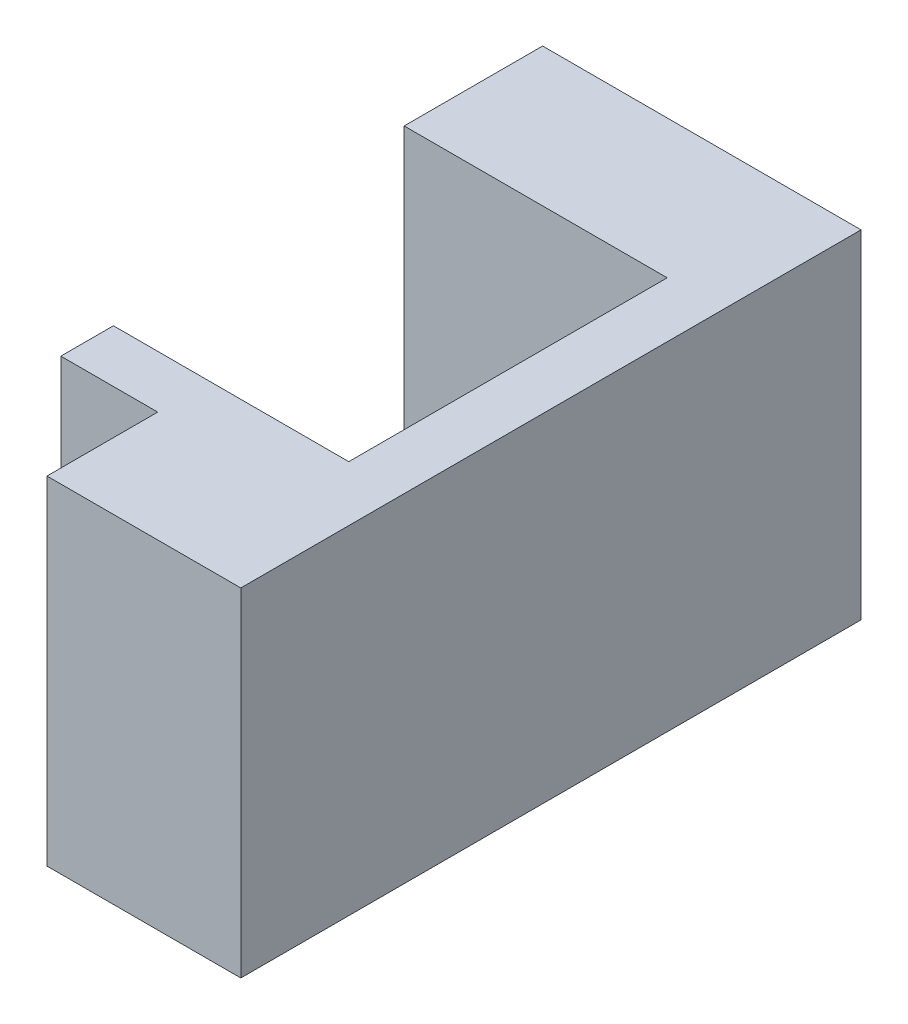
ISO-10303-21;
HEADER;
FILE_DESCRIPTION(('STEP AP214'),'2;1');
FILE_NAME('part.step','',(''),(''),'','','');
FILE_SCHEMA(('AUTOMOTIVE_DESIGN { 1 0 10303 214 1 1 1 1 }'));
ENDSEC;
DATA;
#1=APPLICATION_CONTEXT('core data for automotive mechanical design processes');
#2=APPLICATION_PROTOCOL_DEFINITION('international standard','automotive_design',2000,#1);
#3=PRODUCT_CONTEXT('',#1,'mechanical');
#4=PRODUCT('Part','Part','',(#3));
#5=PRODUCT_RELATED_PRODUCT_CATEGORY('part','',(#4));
#6=PRODUCT_DEFINITION_FORMATION('','',#4);
#7=PRODUCT_DEFINITION_CONTEXT('part definition',#1,'design');
#8=PRODUCT_DEFINITION('design','',#6,#7);
#9=PRODUCT_DEFINITION_SHAPE('','',#8);
#10=(LENGTH_UNIT() NAMED_UNIT(*) SI_UNIT(.MILLI.,.METRE.));
#11=(NAMED_UNIT(*) PLANE_ANGLE_UNIT() SI_UNIT($,.RADIAN.));
#12=(NAMED_UNIT(*) SI_UNIT($,.STERADIAN.) SOLID_ANGLE_UNIT());
#13=UNCERTAINTY_MEASURE_WITH_UNIT(LENGTH_MEASURE(1.E-05),#10,'distance_accuracy_value','');
#14=(GEOMETRIC_REPRESENTATION_CONTEXT(3) GLOBAL_UNCERTAINTY_ASSIGNED_CONTEXT((#13)) GLOBAL_UNIT_ASSIGNED_CONTEXT((#10,
#11,#12)) REPRESENTATION_CONTEXT('',''));
#15=CARTESIAN_POINT('',(0.,0.,0.));
#16=DIRECTION('',(0.,0.,1.));
#17=DIRECTION('',(1.,0.,0.));
#18=AXIS2_PLACEMENT_3D('',#15,#16,#17);
#19=CARTESIAN_POINT('',(0.,12.2,-5.));
#20=DIRECTION('',(1.,0.,0.));
#21=DIRECTION('',(0.,0.,-1.));
#22=AXIS2_PLACEMENT_3D('',#19,#20,#21);
#23=PLANE('',#22);
#24=DIRECTION('',(0.,0.,1.));
#25=VECTOR('',#24,1.);
#26=CARTESIAN_POINT('',(0.,0.,-5.));
#27=LINE('',#26,#25);
#28=CARTESIAN_POINT('',(0.,0.,-5.));
#29=VERTEX_POINT('',#28);
#30=CARTESIAN_POINT('',(0.,0.,0.));
#31=VERTEX_POINT('',#30);
#32=EDGE_CURVE('E144',#29,#31,#27,.T.);
#33=ORIENTED_EDGE('',*,*,#32,.T.);
#34=DIRECTION('',(0.,-1.,0.));
#35=VECTOR('',#34,1.);
#36=CARTESIAN_POINT('',(0.,12.2,0.));
#37=LINE('',#36,#35);
#38=CARTESIAN_POINT('',(0.,12.2,0.));
#39=VERTEX_POINT('',#38);
#40=EDGE_CURVE('E11',#39,#31,#37,.T.);
#41=ORIENTED_EDGE('',*,*,#40,.F.);
#42=DIRECTION('',(0.,0.,1.));
#43=VECTOR('',#42,1.);
#44=CARTESIAN_POINT('',(0.,12.2,-5.));
#45=LINE('',#44,#43);
#46=CARTESIAN_POINT('',(0.,12.2,-5.));
#47=VERTEX_POINT('',#46);
#48=EDGE_CURVE('E162',#47,#39,#45,.T.);
#49=ORIENTED_EDGE('',*,*,#48,.F.);
#50=DIRECTION('',(0.,-1.,0.));
#51=VECTOR('',#50,1.);
#52=CARTESIAN_POINT('',(0.,12.2,-5.));
#53=LINE('',#52,#51);
#54=EDGE_CURVE('E140',#47,#29,#53,.T.);
#55=ORIENTED_EDGE('',*,*,#54,.T.);
#56=EDGE_LOOP('',(#33,#41,#49,#55));
#57=FACE_BOUND('',#56,.T.);
#58=ADVANCED_FACE('F36',(#57),#23,.F.);
#59=CARTESIAN_POINT('',(0.,12.2,0.));
#60=DIRECTION('',(0.,0.,-1.));
#61=DIRECTION('',(-1.,0.,0.));
#62=AXIS2_PLACEMENT_3D('',#59,#60,#61);
#63=PLANE('',#62);
#64=DIRECTION('',(1.,0.,0.));
#65=VECTOR('',#64,1.);
#66=CARTESIAN_POINT('',(0.,0.,0.));
#67=LINE('',#66,#65);
#68=CARTESIAN_POINT('',(9.5,0.,0.));
#69=VERTEX_POINT('',#68);
#70=EDGE_CURVE('E147',#31,#69,#67,.T.);
#71=ORIENTED_EDGE('',*,*,#70,.T.);
#72=DIRECTION('',(0.,-1.,0.));
#73=VECTOR('',#72,1.);
#74=CARTESIAN_POINT('',(9.5,12.2,0.));
#75=LINE('',#74,#73);
#76=CARTESIAN_POINT('',(9.5,12.2,0.));
#77=VERTEX_POINT('',#76);
#78=EDGE_CURVE('E44',#77,#69,#75,.T.);
#79=ORIENTED_EDGE('',*,*,#78,.F.);
#80=DIRECTION('',(1.,0.,0.));
#81=VECTOR('',#80,1.);
#82=CARTESIAN_POINT('',(0.,12.2,0.));
#83=LINE('',#82,#81);
#84=EDGE_CURVE('E101',#39,#77,#83,.T.);
#85=ORIENTED_EDGE('',*,*,#84,.F.);
#86=ORIENTED_EDGE('',*,*,#40,.T.);
#87=EDGE_LOOP('',(#71,#79,#85,#86));
#88=FACE_BOUND('',#87,.T.);
#89=ADVANCED_FACE('F211',(#88),#63,.F.);
#90=CARTESIAN_POINT('',(9.5,12.2,0.));
#91=DIRECTION('',(1.,0.,0.));
#92=DIRECTION('',(0.,0.,-1.));
#93=AXIS2_PLACEMENT_3D('',#90,#91,#92);
#94=PLANE('',#93);
#95=DIRECTION('',(0.,0.,1.));
#96=VECTOR('',#95,1.);
#97=CARTESIAN_POINT('',(9.5,0.,0.));
#98=LINE('',#97,#96);
#99=CARTESIAN_POINT('',(9.5,0.,11.5));
#100=VERTEX_POINT('',#99);
#101=EDGE_CURVE('E149',#69,#100,#98,.T.);
#102=ORIENTED_EDGE('',*,*,#101,.T.);
#103=DIRECTION('',(0.,-1.,0.));
#104=VECTOR('',#103,1.);
#105=CARTESIAN_POINT('',(9.5,12.2,11.5));
#106=LINE('',#105,#104);
#107=CARTESIAN_POINT('',(9.5,12.2,11.5));
#108=VERTEX_POINT('',#107);
#109=EDGE_CURVE('E175',#108,#100,#106,.T.);
#110=ORIENTED_EDGE('',*,*,#109,.F.);
#111=DIRECTION('',(0.,0.,1.));
#112=VECTOR('',#111,1.);
#113=CARTESIAN_POINT('',(9.5,12.2,0.));
#114=LINE('',#113,#112);
#115=EDGE_CURVE('E183',#77,#108,#114,.T.);
#116=ORIENTED_EDGE('',*,*,#115,.F.);
#117=ORIENTED_EDGE('',*,*,#78,.T.);
#118=EDGE_LOOP('',(#102,#110,#116,#117));
#119=FACE_BOUND('',#118,.T.);
#120=ADVANCED_FACE('F181',(#119),#94,.F.);
#121=CARTESIAN_POINT('',(9.5,12.2,11.5));
#122=DIRECTION('',(0.,0.,1.));
#123=DIRECTION('',(1.,0.,0.));
#124=AXIS2_PLACEMENT_3D('',#121,#122,#123);
#125=PLANE('',#124);
#126=DIRECTION('',(-1.,0.,0.));
#127=VECTOR('',#126,1.);
#128=CARTESIAN_POINT('',(9.5,0.,11.5));
#129=LINE('',#128,#127);
#130=CARTESIAN_POINT('',(0.999999999999999,0.,11.5));
#131=VERTEX_POINT('',#130);
#132=EDGE_CURVE('E151',#100,#131,#129,.T.);
#133=ORIENTED_EDGE('',*,*,#132,.T.);
#134=DIRECTION('',(0.,-1.,0.));
#135=VECTOR('',#134,1.);
#136=CARTESIAN_POINT('',(0.999999999999999,12.2,11.5));
#137=LINE('',#136,#135);
#138=CARTESIAN_POINT('',(0.999999999999999,12.2,11.5));
#139=VERTEX_POINT('',#138);
#140=EDGE_CURVE('E172',#139,#131,#137,.T.);
#141=ORIENTED_EDGE('',*,*,#140,.F.);
#142=DIRECTION('',(-1.,0.,0.));
#143=VECTOR('',#142,1.);
#144=CARTESIAN_POINT('',(9.5,12.2,11.5));
#145=LINE('',#144,#143);
#146=EDGE_CURVE('E201',#108,#139,#145,.T.);
#147=ORIENTED_EDGE('',*,*,#146,.F.);
#148=ORIENTED_EDGE('',*,*,#109,.T.);
#149=EDGE_LOOP('',(#133,#141,#147,#148));
#150=FACE_BOUND('',#149,.T.);
#151=ADVANCED_FACE('F192',(#150),#125,.F.);
#152=CARTESIAN_POINT('',(0.999999999999999,12.2,11.5));
#153=DIRECTION('',(1.,0.,0.));
#154=DIRECTION('',(0.,0.,-1.));
#155=AXIS2_PLACEMENT_3D('',#152,#153,#154);
#156=PLANE('',#155);
#157=DIRECTION('',(0.,0.,1.));
#158=VECTOR('',#157,1.);
#159=CARTESIAN_POINT('',(0.999999999999999,0.,11.5));
#160=LINE('',#159,#158);
#161=CARTESIAN_POINT('',(0.999999999999999,0.,13.4));
#162=VERTEX_POINT('',#161);
#163=EDGE_CURVE('E153',#131,#162,#160,.T.);
#164=ORIENTED_EDGE('',*,*,#163,.T.);
#165=DIRECTION('',(0.,-1.,0.));
#166=VECTOR('',#165,1.);
#167=CARTESIAN_POINT('',(0.999999999999999,12.2,13.4));
#168=LINE('',#167,#166);
#169=CARTESIAN_POINT('',(0.999999999999999,12.2,13.4));
#170=VERTEX_POINT('',#169);
#171=EDGE_CURVE('E169',#170,#162,#168,.T.);
#172=ORIENTED_EDGE('',*,*,#171,.F.);
#173=DIRECTION('',(0.,0.,1.));
#174=VECTOR('',#173,1.);
#175=CARTESIAN_POINT('',(0.999999999999999,12.2,11.5));
#176=LINE('',#175,#174);
#177=EDGE_CURVE('E198',#139,#170,#176,.T.);
#178=ORIENTED_EDGE('',*,*,#177,.F.);
#179=ORIENTED_EDGE('',*,*,#140,.T.);
#180=EDGE_LOOP('',(#164,#172,#178,#179));
#181=FACE_BOUND('',#180,.T.);
#182=ADVANCED_FACE('F196',(#181),#156,.F.);
#183=CARTESIAN_POINT('',(0.999999999999999,12.2,13.4));
#184=DIRECTION('',(0.,0.,-1.));
#185=DIRECTION('',(-1.,0.,0.));
#186=AXIS2_PLACEMENT_3D('',#183,#184,#185);
#187=PLANE('',#186);
#188=DIRECTION('',(1.,0.,0.));
#189=VECTOR('',#188,1.);
#190=CARTESIAN_POINT('',(0.999999999999999,0.,13.4));
#191=LINE('',#190,#189);
#192=CARTESIAN_POINT('',(4.5,0.,13.4));
#193=VERTEX_POINT('',#192);
#194=EDGE_CURVE('E155',#162,#193,#191,.T.);
#195=ORIENTED_EDGE('',*,*,#194,.T.);
#196=DIRECTION('',(0.,-1.,0.));
#197=VECTOR('',#196,1.);
#198=CARTESIAN_POINT('',(4.5,12.2,13.4));
#199=LINE('',#198,#197);
#200=CARTESIAN_POINT('',(4.5,12.2,13.4));
#201=VERTEX_POINT('',#200);
#202=EDGE_CURVE('E166',#201,#193,#199,.T.);
#203=ORIENTED_EDGE('',*,*,#202,.F.);
#204=DIRECTION('',(1.,0.,0.));
#205=VECTOR('',#204,1.);
#206=CARTESIAN_POINT('',(0.999999999999999,12.2,13.4));
#207=LINE('',#206,#205);
#208=EDGE_CURVE('E200',#170,#201,#207,.T.);
#209=ORIENTED_EDGE('',*,*,#208,.F.);
#210=ORIENTED_EDGE('',*,*,#171,.T.);
#211=EDGE_LOOP('',(#195,#203,#209,#210));
#212=FACE_BOUND('',#211,.T.);
#213=ADVANCED_FACE('F223',(#212),#187,.F.);
#214=CARTESIAN_POINT('',(4.5,12.2,17.4));
#215=DIRECTION('',(1.,0.,0.));
#216=DIRECTION('',(0.,0.,-1.));
#217=AXIS2_PLACEMENT_3D('',#214,#215,#216);
#218=PLANE('',#217);
#219=DIRECTION('',(0.,0.,1.));
#220=VECTOR('',#219,1.);
#221=CARTESIAN_POINT('',(4.5,0.,17.4));
#222=LINE('',#221,#220);
#223=CARTESIAN_POINT('',(4.5,0.,17.4));
#224=VERTEX_POINT('',#223);
#225=EDGE_CURVE('E157',#193,#224,#222,.T.);
#226=ORIENTED_EDGE('',*,*,#225,.T.);
#227=DIRECTION('',(0.,-1.,0.));
#228=VECTOR('',#227,1.);
#229=CARTESIAN_POINT('',(4.5,12.2,17.4));
#230=LINE('',#229,#228);
#231=CARTESIAN_POINT('',(4.5,12.2,17.4));
#232=VERTEX_POINT('',#231);
#233=EDGE_CURVE('E135',#232,#224,#230,.T.);
#234=ORIENTED_EDGE('',*,*,#233,.F.);
#235=DIRECTION('',(0.,0.,1.));
#236=VECTOR('',#235,1.);
#237=CARTESIAN_POINT('',(4.5,12.2,17.4));
#238=LINE('',#237,#236);
#239=EDGE_CURVE('E126',#201,#232,#238,.T.);
#240=ORIENTED_EDGE('',*,*,#239,.F.);
#241=ORIENTED_EDGE('',*,*,#202,.T.);
#242=EDGE_LOOP('',(#226,#234,#240,#241));
#243=FACE_BOUND('',#242,.T.);
#244=ADVANCED_FACE('F226',(#243),#218,.F.);
#245=CARTESIAN_POINT('',(4.5,12.2,17.4));
#246=DIRECTION('',(0.,0.,-1.));
#247=DIRECTION('',(-1.,0.,0.));
#248=AXIS2_PLACEMENT_3D('',#245,#246,#247);
#249=PLANE('',#248);
#250=DIRECTION('',(1.,0.,0.));
#251=VECTOR('',#250,1.);
#252=CARTESIAN_POINT('',(4.5,0.,17.4));
#253=LINE('',#252,#251);
#254=CARTESIAN_POINT('',(11.5,0.,17.4));
#255=VERTEX_POINT('',#254);
#256=EDGE_CURVE('E134',#224,#255,#253,.T.);
#257=ORIENTED_EDGE('',*,*,#256,.T.);
#258=DIRECTION('',(0.,-1.,0.));
#259=VECTOR('',#258,1.);
#260=CARTESIAN_POINT('',(11.5,12.2,17.4));
#261=LINE('',#260,#259);
#262=CARTESIAN_POINT('',(11.5,12.2,17.4));
#263=VERTEX_POINT('',#262);
#264=EDGE_CURVE('E131',#263,#255,#261,.T.);
#265=ORIENTED_EDGE('',*,*,#264,.F.);
#266=DIRECTION('',(1.,0.,0.));
#267=VECTOR('',#266,1.);
#268=CARTESIAN_POINT('',(4.5,12.2,17.4));
#269=LINE('',#268,#267);
#270=EDGE_CURVE('E120',#232,#263,#269,.T.);
#271=ORIENTED_EDGE('',*,*,#270,.F.);
#272=ORIENTED_EDGE('',*,*,#233,.T.);
#273=EDGE_LOOP('',(#257,#265,#271,#272));
#274=FACE_BOUND('',#273,.T.);
#275=ADVANCED_FACE('F132',(#274),#249,.F.);
#276=CARTESIAN_POINT('',(11.5,12.2,17.4));
#277=DIRECTION('',(-1.,0.,0.));
#278=DIRECTION('',(0.,0.,1.));
#279=AXIS2_PLACEMENT_3D('',#276,#277,#278);
#280=PLANE('',#279);
#281=DIRECTION('',(0.,0.,-1.));
#282=VECTOR('',#281,1.);
#283=CARTESIAN_POINT('',(11.5,0.,17.4));
#284=LINE('',#283,#282);
#285=CARTESIAN_POINT('',(11.5,0.,-5.));
#286=VERTEX_POINT('',#285);
#287=EDGE_CURVE('E87',#255,#286,#284,.T.);
#288=ORIENTED_EDGE('',*,*,#287,.T.);
#289=DIRECTION('',(0.,-1.,0.));
#290=VECTOR('',#289,1.);
#291=CARTESIAN_POINT('',(11.5,12.2,-5.));
#292=LINE('',#291,#290);
#293=CARTESIAN_POINT('',(11.5,12.2,-5.));
#294=VERTEX_POINT('',#293);
#295=EDGE_CURVE('E136',#294,#286,#292,.T.);
#296=ORIENTED_EDGE('',*,*,#295,.F.);
#297=DIRECTION('',(0.,0.,-1.));
#298=VECTOR('',#297,1.);
#299=CARTESIAN_POINT('',(11.5,12.2,17.4));
#300=LINE('',#299,#298);
#301=EDGE_CURVE('E124',#263,#294,#300,.T.);
#302=ORIENTED_EDGE('',*,*,#301,.F.);
#303=ORIENTED_EDGE('',*,*,#264,.T.);
#304=EDGE_LOOP('',(#288,#296,#302,#303));
#305=FACE_BOUND('',#304,.T.);
#306=ADVANCED_FACE('F138',(#305),#280,.F.);
#307=CARTESIAN_POINT('',(11.5,12.2,-5.));
#308=DIRECTION('',(0.,0.,1.));
#309=DIRECTION('',(1.,0.,0.));
#310=AXIS2_PLACEMENT_3D('',#307,#308,#309);
#311=PLANE('',#310);
#312=DIRECTION('',(-1.,0.,0.));
#313=VECTOR('',#312,1.);
#314=CARTESIAN_POINT('',(11.5,0.,-5.));
#315=LINE('',#314,#313);
#316=EDGE_CURVE('E93',#286,#29,#315,.T.);
#317=ORIENTED_EDGE('',*,*,#316,.T.);
#318=ORIENTED_EDGE('',*,*,#54,.F.);
#319=DIRECTION('',(-1.,0.,0.));
#320=VECTOR('',#319,1.);
#321=CARTESIAN_POINT('',(11.5,12.2,-5.));
#322=LINE('',#321,#320);
#323=EDGE_CURVE('E52',#294,#47,#322,.T.);
#324=ORIENTED_EDGE('',*,*,#323,.F.);
#325=ORIENTED_EDGE('',*,*,#295,.T.);
#326=EDGE_LOOP('',(#317,#318,#324,#325));
#327=FACE_BOUND('',#326,.T.);
#328=ADVANCED_FACE('F235',(#327),#311,.F.);
#329=CARTESIAN_POINT('',(0.,12.2,0.));
#330=DIRECTION('',(0.,1.,0.));
#331=DIRECTION('',(0.,0.,1.));
#332=AXIS2_PLACEMENT_3D('',#329,#330,#331);
#333=PLANE('',#332);
#334=ORIENTED_EDGE('',*,*,#48,.T.);
#335=ORIENTED_EDGE('',*,*,#84,.T.);
#336=ORIENTED_EDGE('',*,*,#115,.T.);
#337=ORIENTED_EDGE('',*,*,#146,.T.);
#338=ORIENTED_EDGE('',*,*,#177,.T.);
#339=ORIENTED_EDGE('',*,*,#208,.T.);
#340=ORIENTED_EDGE('',*,*,#239,.T.);
#341=ORIENTED_EDGE('',*,*,#270,.T.);
#342=ORIENTED_EDGE('',*,*,#301,.T.);
#343=ORIENTED_EDGE('',*,*,#323,.T.);
#344=EDGE_LOOP('',(#334,#335,#336,#337,#338,#339,#340,#341,#342,#343));
#345=FACE_BOUND('',#344,.T.);
#346=ADVANCED_FACE('F122',(#345),#333,.T.);
#347=CARTESIAN_POINT('',(0.,0.,0.));
#348=DIRECTION('',(0.,1.,0.));
#349=DIRECTION('',(0.,0.,1.));
#350=AXIS2_PLACEMENT_3D('',#347,#348,#349);
#351=PLANE('',#350);
#352=ORIENTED_EDGE('',*,*,#32,.F.);
#353=ORIENTED_EDGE('',*,*,#316,.F.);
#354=ORIENTED_EDGE('',*,*,#287,.F.);
#355=ORIENTED_EDGE('',*,*,#256,.F.);
#356=ORIENTED_EDGE('',*,*,#225,.F.);
#357=ORIENTED_EDGE('',*,*,#194,.F.);
#358=ORIENTED_EDGE('',*,*,#163,.F.);
#359=ORIENTED_EDGE('',*,*,#132,.F.);
#360=ORIENTED_EDGE('',*,*,#101,.F.);
#361=ORIENTED_EDGE('',*,*,#70,.F.);
#362=EDGE_LOOP('',(#352,#353,#354,#355,#356,#357,#358,#359,#360,#361));
#363=FACE_BOUND('',#362,.T.);
#364=ADVANCED_FACE('F187',(#363),#351,.F.);
#365=CLOSED_SHELL('',(#58,#89,#120,#151,#182,#213,#244,#275,#306,#328,#346,#364));
#366=MANIFOLD_SOLID_BREP('B2',#365);
#367=ADVANCED_BREP_SHAPE_REPRESENTATION('',(#18,#366),#14);
#368=SHAPE_DEFINITION_REPRESENTATION(#9,#367);
ENDSEC;
END-ISO-10303-21;
